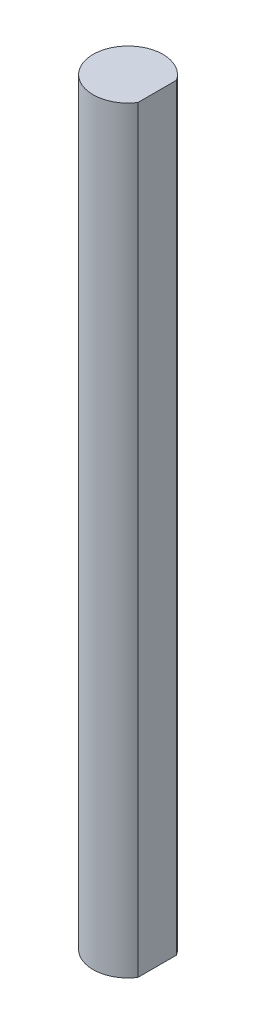
ISO-10303-21;
HEADER;
FILE_DESCRIPTION(('STEP AP214'),'2;1');
FILE_NAME('part.step','',(''),(''),'','','');
FILE_SCHEMA(('AUTOMOTIVE_DESIGN { 1 0 10303 214 1 1 1 1 }'));
ENDSEC;
DATA;
#1=APPLICATION_CONTEXT('core data for automotive mechanical design processes');
#2=APPLICATION_PROTOCOL_DEFINITION('international standard','automotive_design',2000,#1);
#3=PRODUCT_CONTEXT('',#1,'mechanical');
#4=PRODUCT('Part','Part','',(#3));
#5=PRODUCT_RELATED_PRODUCT_CATEGORY('part','',(#4));
#6=PRODUCT_DEFINITION_FORMATION('','',#4);
#7=PRODUCT_DEFINITION_CONTEXT('part definition',#1,'design');
#8=PRODUCT_DEFINITION('design','',#6,#7);
#9=PRODUCT_DEFINITION_SHAPE('','',#8);
#10=(LENGTH_UNIT() NAMED_UNIT(*) SI_UNIT(.MILLI.,.METRE.));
#11=(NAMED_UNIT(*) PLANE_ANGLE_UNIT() SI_UNIT($,.RADIAN.));
#12=(NAMED_UNIT(*) SI_UNIT($,.STERADIAN.) SOLID_ANGLE_UNIT());
#13=UNCERTAINTY_MEASURE_WITH_UNIT(LENGTH_MEASURE(1.E-05),#10,'distance_accuracy_value','');
#14=(GEOMETRIC_REPRESENTATION_CONTEXT(3) GLOBAL_UNCERTAINTY_ASSIGNED_CONTEXT((#13)) GLOBAL_UNIT_ASSIGNED_CONTEXT((#10,
#11,#12)) REPRESENTATION_CONTEXT('',''));
#15=CARTESIAN_POINT('',(0.,0.,0.));
#16=DIRECTION('',(0.,0.,1.));
#17=DIRECTION('',(1.,0.,0.));
#18=AXIS2_PLACEMENT_3D('',#15,#16,#17);
#19=CARTESIAN_POINT('',(2.5,65.,0.));
#20=DIRECTION('',(-1.,0.,0.));
#21=DIRECTION('',(0.,0.,1.));
#22=AXIS2_PLACEMENT_3D('',#19,#20,#21);
#23=PLANE('',#22);
#24=DIRECTION('',(0.,0.,-1.));
#25=VECTOR('',#24,1.);
#26=CARTESIAN_POINT('',(2.5,0.,0.));
#27=LINE('',#26,#25);
#28=CARTESIAN_POINT('',(2.5,0.,1.6583123951777));
#29=VERTEX_POINT('',#28);
#30=CARTESIAN_POINT('',(2.5,0.,-1.6583123951777));
#31=VERTEX_POINT('',#30);
#32=EDGE_CURVE('E66',#29,#31,#27,.T.);
#33=ORIENTED_EDGE('',*,*,#32,.T.);
#34=DIRECTION('',(0.,-1.,0.));
#35=VECTOR('',#34,1.);
#36=CARTESIAN_POINT('',(2.5,65.,-1.6583123951777));
#37=LINE('',#36,#35);
#38=CARTESIAN_POINT('',(2.5,65.,-1.6583123951777));
#39=VERTEX_POINT('',#38);
#40=EDGE_CURVE('E11',#39,#31,#37,.T.);
#41=ORIENTED_EDGE('',*,*,#40,.F.);
#42=DIRECTION('',(0.,0.,-1.));
#43=VECTOR('',#42,1.);
#44=CARTESIAN_POINT('',(2.5,65.,0.));
#45=LINE('',#44,#43);
#46=CARTESIAN_POINT('',(2.5,65.,1.6583123951777));
#47=VERTEX_POINT('',#46);
#48=EDGE_CURVE('E65',#47,#39,#45,.T.);
#49=ORIENTED_EDGE('',*,*,#48,.F.);
#50=DIRECTION('',(0.,-1.,0.));
#51=VECTOR('',#50,1.);
#52=CARTESIAN_POINT('',(2.5,65.,1.6583123951777));
#53=LINE('',#52,#51);
#54=EDGE_CURVE('E43',#47,#29,#53,.T.);
#55=ORIENTED_EDGE('',*,*,#54,.T.);
#56=EDGE_LOOP('',(#33,#41,#49,#55));
#57=FACE_BOUND('',#56,.T.);
#58=ADVANCED_FACE('F35',(#57),#23,.F.);
#59=CARTESIAN_POINT('',(0.,65.,0.));
#60=DIRECTION('',(0.,-1.,0.));
#61=DIRECTION('',(0.,0.,-1.));
#62=AXIS2_PLACEMENT_3D('',#59,#60,#61);
#63=CYLINDRICAL_SURFACE('',#62,3.);
#64=CARTESIAN_POINT('',(0.,0.,0.));
#65=DIRECTION('',(0.,1.,0.));
#66=DIRECTION('',(0.,0.,1.));
#67=AXIS2_PLACEMENT_3D('',#64,#65,#66);
#68=CIRCLE('',#67,3.);
#69=EDGE_CURVE('E58',#31,#29,#68,.T.);
#70=ORIENTED_EDGE('',*,*,#69,.T.);
#71=ORIENTED_EDGE('',*,*,#54,.F.);
#72=CARTESIAN_POINT('',(0.,65.,0.));
#73=DIRECTION('',(0.,1.,0.));
#74=DIRECTION('',(0.,0.,1.));
#75=AXIS2_PLACEMENT_3D('',#72,#73,#74);
#76=CIRCLE('',#75,3.);
#77=EDGE_CURVE('E50',#39,#47,#76,.T.);
#78=ORIENTED_EDGE('',*,*,#77,.F.);
#79=ORIENTED_EDGE('',*,*,#40,.T.);
#80=EDGE_LOOP('',(#70,#71,#78,#79));
#81=FACE_BOUND('',#80,.T.);
#82=ADVANCED_FACE('F61',(#81),#63,.T.);
#83=CARTESIAN_POINT('',(0.,65.,0.));
#84=DIRECTION('',(0.,1.,0.));
#85=DIRECTION('',(0.,0.,1.));
#86=AXIS2_PLACEMENT_3D('',#83,#84,#85);
#87=PLANE('',#86);
#88=ORIENTED_EDGE('',*,*,#48,.T.);
#89=ORIENTED_EDGE('',*,*,#77,.T.);
#90=EDGE_LOOP('',(#88,#89));
#91=FACE_BOUND('',#90,.T.);
#92=ADVANCED_FACE('F73',(#91),#87,.T.);
#93=CARTESIAN_POINT('',(0.,0.,0.));
#94=DIRECTION('',(0.,1.,0.));
#95=DIRECTION('',(0.,0.,1.));
#96=AXIS2_PLACEMENT_3D('',#93,#94,#95);
#97=PLANE('',#96);
#98=ORIENTED_EDGE('',*,*,#32,.F.);
#99=ORIENTED_EDGE('',*,*,#69,.F.);
#100=EDGE_LOOP('',(#98,#99));
#101=FACE_BOUND('',#100,.T.);
#102=ADVANCED_FACE('F69',(#101),#97,.F.);
#103=CLOSED_SHELL('',(#58,#82,#92,#102));
#104=MANIFOLD_SOLID_BREP('B2',#103);
#105=ADVANCED_BREP_SHAPE_REPRESENTATION('',(#18,#104),#14);
#106=SHAPE_DEFINITION_REPRESENTATION(#9,#105);
ENDSEC;
END-ISO-10303-21;
